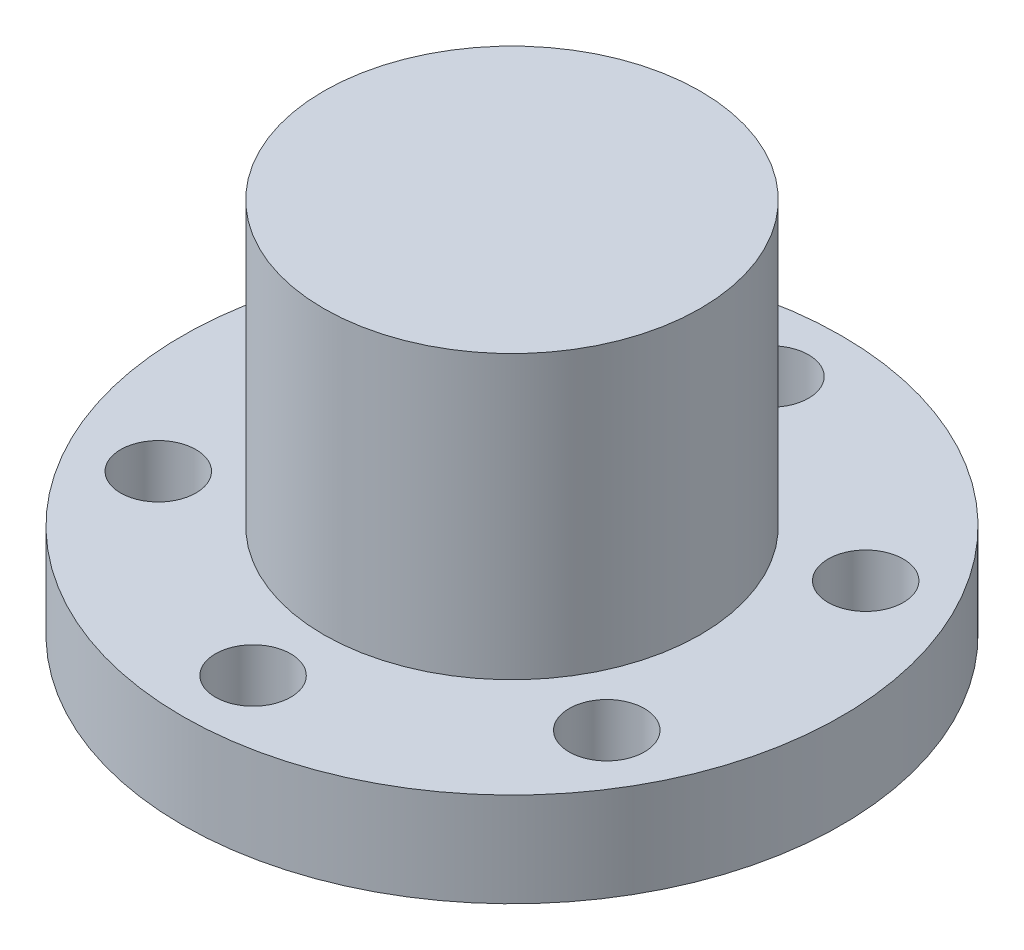
ISO-10303-21;
HEADER;
FILE_DESCRIPTION(('STEP AP214'),'2;1');
FILE_NAME('part.step','',(''),(''),'','','');
FILE_SCHEMA(('AUTOMOTIVE_DESIGN { 1 0 10303 214 1 1 1 1 }'));
ENDSEC;
DATA;
#1=APPLICATION_CONTEXT('core data for automotive mechanical design processes');
#2=APPLICATION_PROTOCOL_DEFINITION('international standard','automotive_design',2000,#1);
#3=PRODUCT_CONTEXT('',#1,'mechanical');
#4=PRODUCT('Part','Part','',(#3));
#5=PRODUCT_RELATED_PRODUCT_CATEGORY('part','',(#4));
#6=PRODUCT_DEFINITION_FORMATION('','',#4);
#7=PRODUCT_DEFINITION_CONTEXT('part definition',#1,'design');
#8=PRODUCT_DEFINITION('design','',#6,#7);
#9=PRODUCT_DEFINITION_SHAPE('','',#8);
#10=(LENGTH_UNIT() NAMED_UNIT(*) SI_UNIT(.MILLI.,.METRE.));
#11=(NAMED_UNIT(*) PLANE_ANGLE_UNIT() SI_UNIT($,.RADIAN.));
#12=(NAMED_UNIT(*) SI_UNIT($,.STERADIAN.) SOLID_ANGLE_UNIT());
#13=UNCERTAINTY_MEASURE_WITH_UNIT(LENGTH_MEASURE(1.E-05),#10,'distance_accuracy_value','');
#14=(GEOMETRIC_REPRESENTATION_CONTEXT(3) GLOBAL_UNCERTAINTY_ASSIGNED_CONTEXT((#13)) GLOBAL_UNIT_ASSIGNED_CONTEXT((#10,
#11,#12)) REPRESENTATION_CONTEXT('',''));
#15=CARTESIAN_POINT('',(0.,0.,0.));
#16=DIRECTION('',(0.,0.,1.));
#17=DIRECTION('',(1.,0.,0.));
#18=AXIS2_PLACEMENT_3D('',#15,#16,#17);
#19=CARTESIAN_POINT('',(0.,5.,0.));
#20=DIRECTION('',(0.,1.,0.));
#21=DIRECTION('',(0.,0.,1.));
#22=AXIS2_PLACEMENT_3D('',#19,#20,#21);
#23=PLANE('',#22);
#24=CARTESIAN_POINT('',(0.,5.,0.));
#25=DIRECTION('',(0.,1.,0.));
#26=DIRECTION('',(0.,0.,1.));
#27=AXIS2_PLACEMENT_3D('',#24,#25,#26);
#28=CIRCLE('',#27,10.);
#29=CARTESIAN_POINT('',(0.,5.,10.));
#30=VERTEX_POINT('',#29);
#31=EDGE_CURVE('E84',#30,#30,#28,.T.);
#32=ORIENTED_EDGE('',*,*,#31,.F.);
#33=EDGE_LOOP('',(#32));
#34=FACE_BOUND('',#33,.T.);
#35=CARTESIAN_POINT('',(-11.907849302036,5.,6.87500000000001));
#36=DIRECTION('',(0.,1.,0.));
#37=DIRECTION('',(0.,0.,1.));
#38=AXIS2_PLACEMENT_3D('',#35,#36,#37);
#39=CIRCLE('',#38,2.00000000000013);
#40=CARTESIAN_POINT('',(-11.907849302036,5.,8.87500000000013));
#41=VERTEX_POINT('',#40);
#42=EDGE_CURVE('E69',#41,#41,#39,.T.);
#43=ORIENTED_EDGE('',*,*,#42,.F.);
#44=EDGE_LOOP('',(#43));
#45=FACE_BOUND('',#44,.T.);
#46=CARTESIAN_POINT('',(11.907849302036,5.,6.875));
#47=DIRECTION('',(0.,1.,0.));
#48=DIRECTION('',(0.,0.,1.));
#49=AXIS2_PLACEMENT_3D('',#46,#47,#48);
#50=CIRCLE('',#49,2.00000000000006);
#51=CARTESIAN_POINT('',(11.907849302036,5.,8.87500000000006));
#52=VERTEX_POINT('',#51);
#53=EDGE_CURVE('E57',#52,#52,#50,.T.);
#54=ORIENTED_EDGE('',*,*,#53,.F.);
#55=EDGE_LOOP('',(#54));
#56=FACE_BOUND('',#55,.T.);
#57=CARTESIAN_POINT('',(0.,5.,-13.75));
#58=DIRECTION('',(0.,1.,0.));
#59=DIRECTION('',(0.,0.,1.));
#60=AXIS2_PLACEMENT_3D('',#57,#58,#59);
#61=CIRCLE('',#60,2.);
#62=CARTESIAN_POINT('',(0.,5.,-11.75));
#63=VERTEX_POINT('',#62);
#64=EDGE_CURVE('E46',#63,#63,#61,.T.);
#65=ORIENTED_EDGE('',*,*,#64,.F.);
#66=EDGE_LOOP('',(#65));
#67=FACE_BOUND('',#66,.T.);
#68=CARTESIAN_POINT('',(0.,5.,0.));
#69=DIRECTION('',(0.,1.,0.));
#70=DIRECTION('',(0.,0.,1.));
#71=AXIS2_PLACEMENT_3D('',#68,#69,#70);
#72=CIRCLE('',#71,17.5);
#73=CARTESIAN_POINT('',(0.,5.,17.5));
#74=VERTEX_POINT('',#73);
#75=EDGE_CURVE('E10',#74,#74,#72,.T.);
#76=ORIENTED_EDGE('',*,*,#75,.T.);
#77=EDGE_LOOP('',(#76));
#78=FACE_BOUND('',#77,.T.);
#79=CARTESIAN_POINT('',(11.9078493020363,5.,-6.87499999999999));
#80=DIRECTION('',(0.,1.,0.));
#81=DIRECTION('',(0.,0.,1.));
#82=AXIS2_PLACEMENT_3D('',#79,#80,#81);
#83=CIRCLE('',#82,1.99999999999981);
#84=CARTESIAN_POINT('',(11.9078493020363,5.,-4.87500000000019));
#85=VERTEX_POINT('',#84);
#86=EDGE_CURVE('E51',#85,#85,#83,.T.);
#87=ORIENTED_EDGE('',*,*,#86,.F.);
#88=EDGE_LOOP('',(#87));
#89=FACE_BOUND('',#88,.T.);
#90=CARTESIAN_POINT('',(0.,5.,13.75));
#91=DIRECTION('',(0.,1.,0.));
#92=DIRECTION('',(0.,0.,1.));
#93=AXIS2_PLACEMENT_3D('',#90,#91,#92);
#94=CIRCLE('',#93,2.00000000000009);
#95=CARTESIAN_POINT('',(0.,5.,15.7500000000001));
#96=VERTEX_POINT('',#95);
#97=EDGE_CURVE('E63',#96,#96,#94,.T.);
#98=ORIENTED_EDGE('',*,*,#97,.F.);
#99=EDGE_LOOP('',(#98));
#100=FACE_BOUND('',#99,.T.);
#101=CARTESIAN_POINT('',(-11.9078493020362,5.,-6.87499999999974));
#102=DIRECTION('',(0.,1.,0.));
#103=DIRECTION('',(0.,0.,1.));
#104=AXIS2_PLACEMENT_3D('',#101,#102,#103);
#105=CIRCLE('',#104,2.00000000000044);
#106=CARTESIAN_POINT('',(-11.9078493020362,5.,-4.8749999999993));
#107=VERTEX_POINT('',#106);
#108=EDGE_CURVE('E75',#107,#107,#105,.T.);
#109=ORIENTED_EDGE('',*,*,#108,.F.);
#110=EDGE_LOOP('',(#109));
#111=FACE_BOUND('',#110,.T.);
#112=ADVANCED_FACE('F35',(#34,#45,#56,#67,#78,#89,#100,#111),#23,.T.);
#113=CARTESIAN_POINT('',(0.,0.,0.));
#114=DIRECTION('',(0.,1.,0.));
#115=DIRECTION('',(0.,0.,1.));
#116=AXIS2_PLACEMENT_3D('',#113,#114,#115);
#117=PLANE('',#116);
#118=CARTESIAN_POINT('',(0.,0.,0.));
#119=DIRECTION('',(0.,1.,0.));
#120=DIRECTION('',(0.,0.,1.));
#121=AXIS2_PLACEMENT_3D('',#118,#119,#120);
#122=CIRCLE('',#121,17.5);
#123=CARTESIAN_POINT('',(0.,0.,17.5));
#124=VERTEX_POINT('',#123);
#125=EDGE_CURVE('E39',#124,#124,#122,.T.);
#126=ORIENTED_EDGE('',*,*,#125,.F.);
#127=EDGE_LOOP('',(#126));
#128=FACE_BOUND('',#127,.T.);
#129=CARTESIAN_POINT('',(0.,0.,-13.75));
#130=DIRECTION('',(0.,1.,0.));
#131=DIRECTION('',(0.,0.,1.));
#132=AXIS2_PLACEMENT_3D('',#129,#130,#131);
#133=CIRCLE('',#132,2.);
#134=CARTESIAN_POINT('',(0.,0.,-11.75));
#135=VERTEX_POINT('',#134);
#136=EDGE_CURVE('E48',#135,#135,#133,.T.);
#137=ORIENTED_EDGE('',*,*,#136,.T.);
#138=EDGE_LOOP('',(#137));
#139=FACE_BOUND('',#138,.T.);
#140=CARTESIAN_POINT('',(11.9078493020363,0.,-6.87499999999999));
#141=DIRECTION('',(0.,1.,0.));
#142=DIRECTION('',(0.,0.,1.));
#143=AXIS2_PLACEMENT_3D('',#140,#141,#142);
#144=CIRCLE('',#143,1.99999999999981);
#145=CARTESIAN_POINT('',(11.9078493020363,0.,-4.87500000000019));
#146=VERTEX_POINT('',#145);
#147=EDGE_CURVE('E54',#146,#146,#144,.T.);
#148=ORIENTED_EDGE('',*,*,#147,.T.);
#149=EDGE_LOOP('',(#148));
#150=FACE_BOUND('',#149,.T.);
#151=CARTESIAN_POINT('',(11.907849302036,0.,6.875));
#152=DIRECTION('',(0.,1.,0.));
#153=DIRECTION('',(0.,0.,1.));
#154=AXIS2_PLACEMENT_3D('',#151,#152,#153);
#155=CIRCLE('',#154,2.00000000000006);
#156=CARTESIAN_POINT('',(11.907849302036,0.,8.87500000000006));
#157=VERTEX_POINT('',#156);
#158=EDGE_CURVE('E60',#157,#157,#155,.T.);
#159=ORIENTED_EDGE('',*,*,#158,.T.);
#160=EDGE_LOOP('',(#159));
#161=FACE_BOUND('',#160,.T.);
#162=CARTESIAN_POINT('',(0.,0.,13.75));
#163=DIRECTION('',(0.,1.,0.));
#164=DIRECTION('',(0.,0.,1.));
#165=AXIS2_PLACEMENT_3D('',#162,#163,#164);
#166=CIRCLE('',#165,2.00000000000009);
#167=CARTESIAN_POINT('',(0.,0.,15.7500000000001));
#168=VERTEX_POINT('',#167);
#169=EDGE_CURVE('E66',#168,#168,#166,.T.);
#170=ORIENTED_EDGE('',*,*,#169,.T.);
#171=EDGE_LOOP('',(#170));
#172=FACE_BOUND('',#171,.T.);
#173=CARTESIAN_POINT('',(-11.907849302036,0.,6.87500000000001));
#174=DIRECTION('',(0.,1.,0.));
#175=DIRECTION('',(0.,0.,1.));
#176=AXIS2_PLACEMENT_3D('',#173,#174,#175);
#177=CIRCLE('',#176,2.00000000000013);
#178=CARTESIAN_POINT('',(-11.907849302036,0.,8.87500000000013));
#179=VERTEX_POINT('',#178);
#180=EDGE_CURVE('E72',#179,#179,#177,.T.);
#181=ORIENTED_EDGE('',*,*,#180,.T.);
#182=EDGE_LOOP('',(#181));
#183=FACE_BOUND('',#182,.T.);
#184=CARTESIAN_POINT('',(-11.9078493020362,0.,-6.87499999999974));
#185=DIRECTION('',(0.,1.,0.));
#186=DIRECTION('',(0.,0.,1.));
#187=AXIS2_PLACEMENT_3D('',#184,#185,#186);
#188=CIRCLE('',#187,2.00000000000044);
#189=CARTESIAN_POINT('',(-11.9078493020362,0.,-4.8749999999993));
#190=VERTEX_POINT('',#189);
#191=EDGE_CURVE('E78',#190,#190,#188,.T.);
#192=ORIENTED_EDGE('',*,*,#191,.T.);
#193=EDGE_LOOP('',(#192));
#194=FACE_BOUND('',#193,.T.);
#195=ADVANCED_FACE('F101',(#128,#139,#150,#161,#172,#183,#194),#117,.F.);
#196=CARTESIAN_POINT('',(0.,5.,0.));
#197=DIRECTION('',(0.,-1.,0.));
#198=DIRECTION('',(0.,0.,-1.));
#199=AXIS2_PLACEMENT_3D('',#196,#197,#198);
#200=CYLINDRICAL_SURFACE('',#199,17.5);
#201=ORIENTED_EDGE('',*,*,#75,.F.);
#202=EDGE_LOOP('',(#201));
#203=FACE_BOUND('',#202,.T.);
#204=ORIENTED_EDGE('',*,*,#125,.T.);
#205=EDGE_LOOP('',(#204));
#206=FACE_BOUND('',#205,.T.);
#207=ADVANCED_FACE('F37',(#203,#206),#200,.T.);
#208=CARTESIAN_POINT('',(0.,5.,-13.75));
#209=DIRECTION('',(0.,-1.,0.));
#210=DIRECTION('',(0.,0.,-1.));
#211=AXIS2_PLACEMENT_3D('',#208,#209,#210);
#212=CYLINDRICAL_SURFACE('',#211,2.);
#213=ORIENTED_EDGE('',*,*,#64,.T.);
#214=EDGE_LOOP('',(#213));
#215=FACE_BOUND('',#214,.T.);
#216=ORIENTED_EDGE('',*,*,#136,.F.);
#217=EDGE_LOOP('',(#216));
#218=FACE_BOUND('',#217,.T.);
#219=ADVANCED_FACE('F126',(#215,#218),#212,.F.);
#220=CARTESIAN_POINT('',(11.9078493020363,5.,-6.87499999999999));
#221=DIRECTION('',(0.,-1.,0.));
#222=DIRECTION('',(0.,0.,-1.));
#223=AXIS2_PLACEMENT_3D('',#220,#221,#222);
#224=CYLINDRICAL_SURFACE('',#223,1.99999999999981);
#225=ORIENTED_EDGE('',*,*,#86,.T.);
#226=EDGE_LOOP('',(#225));
#227=FACE_BOUND('',#226,.T.);
#228=ORIENTED_EDGE('',*,*,#147,.F.);
#229=EDGE_LOOP('',(#228));
#230=FACE_BOUND('',#229,.T.);
#231=ADVANCED_FACE('F133',(#227,#230),#224,.F.);
#232=CARTESIAN_POINT('',(11.907849302036,5.,6.875));
#233=DIRECTION('',(0.,-1.,0.));
#234=DIRECTION('',(0.,0.,-1.));
#235=AXIS2_PLACEMENT_3D('',#232,#233,#234);
#236=CYLINDRICAL_SURFACE('',#235,2.00000000000006);
#237=ORIENTED_EDGE('',*,*,#53,.T.);
#238=EDGE_LOOP('',(#237));
#239=FACE_BOUND('',#238,.T.);
#240=ORIENTED_EDGE('',*,*,#158,.F.);
#241=EDGE_LOOP('',(#240));
#242=FACE_BOUND('',#241,.T.);
#243=ADVANCED_FACE('F137',(#239,#242),#236,.F.);
#244=CARTESIAN_POINT('',(0.,5.,13.75));
#245=DIRECTION('',(0.,-1.,0.));
#246=DIRECTION('',(0.,0.,-1.));
#247=AXIS2_PLACEMENT_3D('',#244,#245,#246);
#248=CYLINDRICAL_SURFACE('',#247,2.00000000000009);
#249=ORIENTED_EDGE('',*,*,#97,.T.);
#250=EDGE_LOOP('',(#249));
#251=FACE_BOUND('',#250,.T.);
#252=ORIENTED_EDGE('',*,*,#169,.F.);
#253=EDGE_LOOP('',(#252));
#254=FACE_BOUND('',#253,.T.);
#255=ADVANCED_FACE('F141',(#251,#254),#248,.F.);
#256=CARTESIAN_POINT('',(-11.907849302036,5.,6.87500000000001));
#257=DIRECTION('',(0.,-1.,0.));
#258=DIRECTION('',(0.,0.,-1.));
#259=AXIS2_PLACEMENT_3D('',#256,#257,#258);
#260=CYLINDRICAL_SURFACE('',#259,2.00000000000013);
#261=ORIENTED_EDGE('',*,*,#42,.T.);
#262=EDGE_LOOP('',(#261));
#263=FACE_BOUND('',#262,.T.);
#264=ORIENTED_EDGE('',*,*,#180,.F.);
#265=EDGE_LOOP('',(#264));
#266=FACE_BOUND('',#265,.T.);
#267=ADVANCED_FACE('F117',(#263,#266),#260,.F.);
#268=CARTESIAN_POINT('',(-11.9078493020362,5.,-6.87499999999974));
#269=DIRECTION('',(0.,-1.,0.));
#270=DIRECTION('',(0.,0.,-1.));
#271=AXIS2_PLACEMENT_3D('',#268,#269,#270);
#272=CYLINDRICAL_SURFACE('',#271,2.00000000000044);
#273=ORIENTED_EDGE('',*,*,#108,.T.);
#274=EDGE_LOOP('',(#273));
#275=FACE_BOUND('',#274,.T.);
#276=ORIENTED_EDGE('',*,*,#191,.F.);
#277=EDGE_LOOP('',(#276));
#278=FACE_BOUND('',#277,.T.);
#279=ADVANCED_FACE('F95',(#275,#278),#272,.F.);
#280=CARTESIAN_POINT('',(0.,20.,0.));
#281=DIRECTION('',(0.,-1.,0.));
#282=DIRECTION('',(0.,0.,-1.));
#283=AXIS2_PLACEMENT_3D('',#280,#281,#282);
#284=CYLINDRICAL_SURFACE('',#283,10.);
#285=CARTESIAN_POINT('',(0.,20.,0.));
#286=DIRECTION('',(0.,1.,0.));
#287=DIRECTION('',(0.,0.,1.));
#288=AXIS2_PLACEMENT_3D('',#285,#286,#287);
#289=CIRCLE('',#288,10.);
#290=CARTESIAN_POINT('',(0.,20.,10.));
#291=VERTEX_POINT('',#290);
#292=EDGE_CURVE('E81',#291,#291,#289,.T.);
#293=ORIENTED_EDGE('',*,*,#292,.F.);
#294=EDGE_LOOP('',(#293));
#295=FACE_BOUND('',#294,.T.);
#296=ORIENTED_EDGE('',*,*,#31,.T.);
#297=EDGE_LOOP('',(#296));
#298=FACE_BOUND('',#297,.T.);
#299=ADVANCED_FACE('F92',(#295,#298),#284,.T.);
#300=CARTESIAN_POINT('',(0.,20.,0.));
#301=DIRECTION('',(0.,1.,0.));
#302=DIRECTION('',(0.,0.,1.));
#303=AXIS2_PLACEMENT_3D('',#300,#301,#302);
#304=PLANE('',#303);
#305=ORIENTED_EDGE('',*,*,#292,.T.);
#306=EDGE_LOOP('',(#305));
#307=FACE_BOUND('',#306,.T.);
#308=ADVANCED_FACE('F90',(#307),#304,.T.);
#309=CLOSED_SHELL('',(#112,#195,#207,#219,#231,#243,#255,#267,#279,#299,#308));
#310=MANIFOLD_SOLID_BREP('B2',#309);
#311=ADVANCED_BREP_SHAPE_REPRESENTATION('',(#18,#310),#14);
#312=SHAPE_DEFINITION_REPRESENTATION(#9,#311);
ENDSEC;
END-ISO-10303-21;
